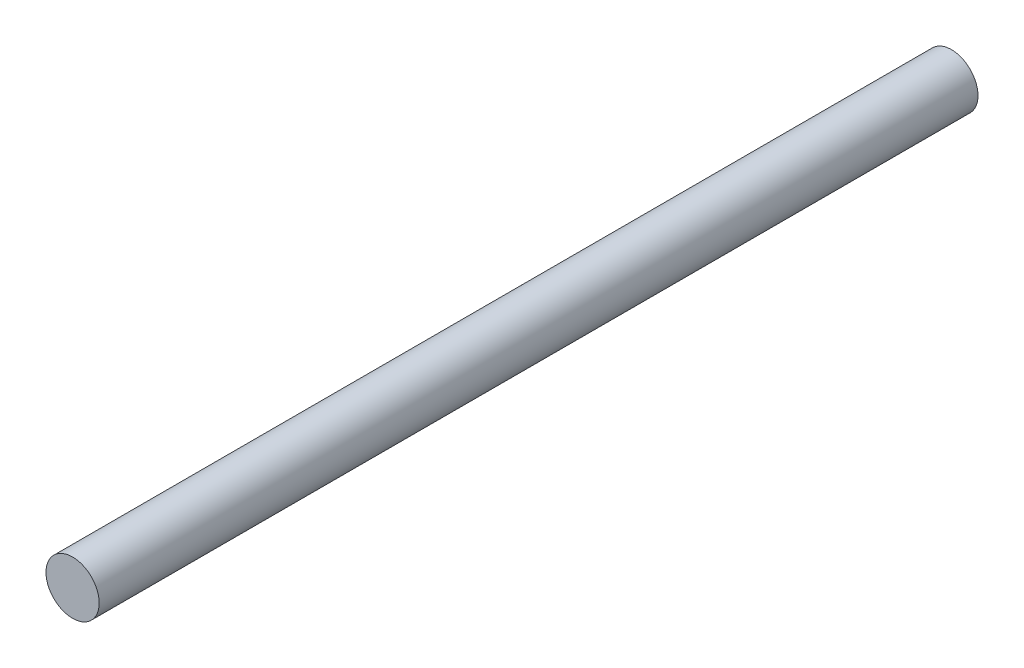
ISO-10303-21;
HEADER;
FILE_DESCRIPTION(('STEP AP214'),'2;1');
FILE_NAME('part.step','',(''),(''),'','','');
FILE_SCHEMA(('AUTOMOTIVE_DESIGN { 1 0 10303 214 1 1 1 1 }'));
ENDSEC;
DATA;
#1=APPLICATION_CONTEXT('core data for automotive mechanical design processes');
#2=APPLICATION_PROTOCOL_DEFINITION('international standard','automotive_design',2000,#1);
#3=PRODUCT_CONTEXT('',#1,'mechanical');
#4=PRODUCT('Part','Part','',(#3));
#5=PRODUCT_RELATED_PRODUCT_CATEGORY('part','',(#4));
#6=PRODUCT_DEFINITION_FORMATION('','',#4);
#7=PRODUCT_DEFINITION_CONTEXT('part definition',#1,'design');
#8=PRODUCT_DEFINITION('design','',#6,#7);
#9=PRODUCT_DEFINITION_SHAPE('','',#8);
#10=(LENGTH_UNIT() NAMED_UNIT(*) SI_UNIT(.MILLI.,.METRE.));
#11=(NAMED_UNIT(*) PLANE_ANGLE_UNIT() SI_UNIT($,.RADIAN.));
#12=(NAMED_UNIT(*) SI_UNIT($,.STERADIAN.) SOLID_ANGLE_UNIT());
#13=UNCERTAINTY_MEASURE_WITH_UNIT(LENGTH_MEASURE(1.E-05),#10,'distance_accuracy_value','');
#14=(GEOMETRIC_REPRESENTATION_CONTEXT(3) GLOBAL_UNCERTAINTY_ASSIGNED_CONTEXT((#13)) GLOBAL_UNIT_ASSIGNED_CONTEXT((#10,
#11,#12)) REPRESENTATION_CONTEXT('',''));
#15=CARTESIAN_POINT('',(0.,0.,0.));
#16=DIRECTION('',(0.,0.,1.));
#17=DIRECTION('',(1.,0.,0.));
#18=AXIS2_PLACEMENT_3D('',#15,#16,#17);
#19=CARTESIAN_POINT('',(0.,0.,36.3553967811146));
#20=DIRECTION('',(0.,0.,1.));
#21=DIRECTION('',(1.,0.,0.));
#22=AXIS2_PLACEMENT_3D('',#19,#20,#21);
#23=PLANE('',#22);
#24=CARTESIAN_POINT('',(0.,0.,36.3553967811146));
#25=DIRECTION('',(0.,0.,-1.));
#26=DIRECTION('',(-1.,0.,0.));
#27=AXIS2_PLACEMENT_3D('',#24,#25,#26);
#28=CIRCLE('',#27,2.2);
#29=CARTESIAN_POINT('',(-2.2,0.,36.3553967811146));
#30=VERTEX_POINT('',#29);
#31=EDGE_CURVE('E9',#30,#30,#28,.T.);
#32=ORIENTED_EDGE('',*,*,#31,.F.);
#33=EDGE_LOOP('',(#32));
#34=FACE_BOUND('',#33,.T.);
#35=ADVANCED_FACE('F14',(#34),#23,.T.);
#36=CARTESIAN_POINT('',(0.,0.,-36.3553967811146));
#37=DIRECTION('',(0.,0.,-1.));
#38=DIRECTION('',(-1.,0.,0.));
#39=AXIS2_PLACEMENT_3D('',#36,#37,#38);
#40=PLANE('',#39);
#41=CARTESIAN_POINT('',(0.,0.,-36.3553967811146));
#42=DIRECTION('',(0.,0.,1.));
#43=DIRECTION('',(1.,0.,0.));
#44=AXIS2_PLACEMENT_3D('',#41,#42,#43);
#45=CIRCLE('',#44,2.2);
#46=CARTESIAN_POINT('',(2.2,0.,-36.3553967811146));
#47=VERTEX_POINT('',#46);
#48=EDGE_CURVE('E21',#47,#47,#45,.T.);
#49=ORIENTED_EDGE('',*,*,#48,.F.);
#50=EDGE_LOOP('',(#49));
#51=FACE_BOUND('',#50,.T.);
#52=ADVANCED_FACE('F29',(#51),#40,.T.);
#53=CARTESIAN_POINT('',(0.,0.,-36.3553967811146));
#54=DIRECTION('',(0.,0.,1.));
#55=DIRECTION('',(1.,0.,0.));
#56=AXIS2_PLACEMENT_3D('',#53,#54,#55);
#57=CYLINDRICAL_SURFACE('',#56,2.2);
#58=ORIENTED_EDGE('',*,*,#31,.T.);
#59=EDGE_LOOP('',(#58));
#60=FACE_BOUND('',#59,.T.);
#61=ORIENTED_EDGE('',*,*,#48,.T.);
#62=EDGE_LOOP('',(#61));
#63=FACE_BOUND('',#62,.T.);
#64=ADVANCED_FACE('F16',(#60,#63),#57,.T.);
#65=CLOSED_SHELL('',(#35,#52,#64));
#66=MANIFOLD_SOLID_BREP('B1',#65);
#67=ADVANCED_BREP_SHAPE_REPRESENTATION('',(#18,#66),#14);
#68=SHAPE_DEFINITION_REPRESENTATION(#9,#67);
ENDSEC;
END-ISO-10303-21;
